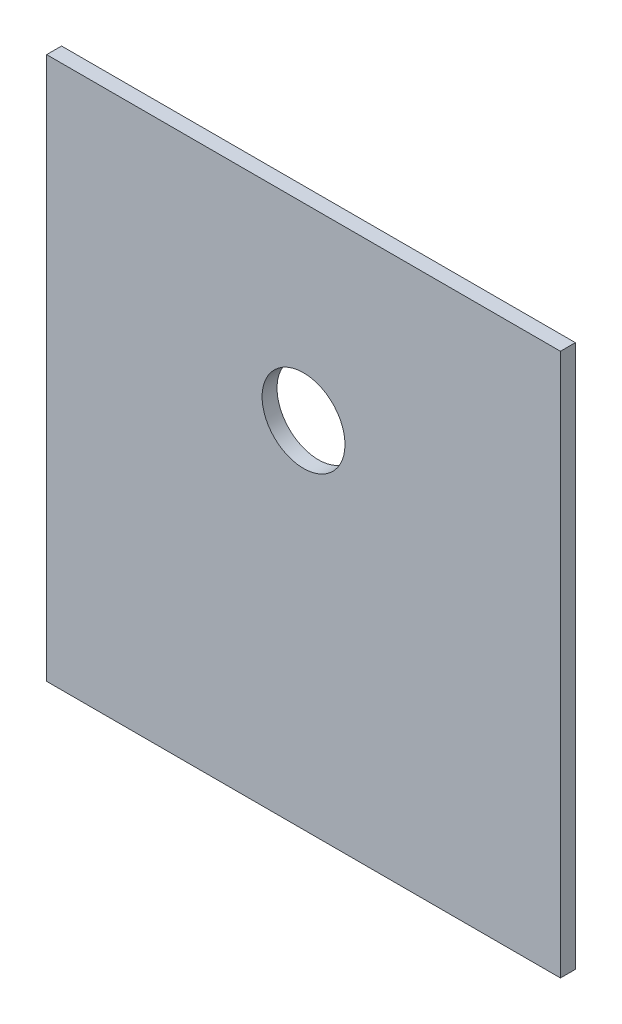
ISO-10303-21;
HEADER;
FILE_DESCRIPTION(('STEP AP214'),'2;1');
FILE_NAME('part.step','',(''),(''),'','','');
FILE_SCHEMA(('AUTOMOTIVE_DESIGN { 1 0 10303 214 1 1 1 1 }'));
ENDSEC;
DATA;
#1=APPLICATION_CONTEXT('core data for automotive mechanical design processes');
#2=APPLICATION_PROTOCOL_DEFINITION('international standard','automotive_design',2000,#1);
#3=PRODUCT_CONTEXT('',#1,'mechanical');
#4=PRODUCT('Part','Part','',(#3));
#5=PRODUCT_RELATED_PRODUCT_CATEGORY('part','',(#4));
#6=PRODUCT_DEFINITION_FORMATION('','',#4);
#7=PRODUCT_DEFINITION_CONTEXT('part definition',#1,'design');
#8=PRODUCT_DEFINITION('design','',#6,#7);
#9=PRODUCT_DEFINITION_SHAPE('','',#8);
#10=(LENGTH_UNIT() NAMED_UNIT(*) SI_UNIT(.MILLI.,.METRE.));
#11=(NAMED_UNIT(*) PLANE_ANGLE_UNIT() SI_UNIT($,.RADIAN.));
#12=(NAMED_UNIT(*) SI_UNIT($,.STERADIAN.) SOLID_ANGLE_UNIT());
#13=UNCERTAINTY_MEASURE_WITH_UNIT(LENGTH_MEASURE(1.E-05),#10,'distance_accuracy_value','');
#14=(GEOMETRIC_REPRESENTATION_CONTEXT(3) GLOBAL_UNCERTAINTY_ASSIGNED_CONTEXT((#13)) GLOBAL_UNIT_ASSIGNED_CONTEXT((#10,
#11,#12)) REPRESENTATION_CONTEXT('',''));
#15=CARTESIAN_POINT('',(0.,0.,0.));
#16=DIRECTION('',(0.,0.,1.));
#17=DIRECTION('',(1.,0.,0.));
#18=AXIS2_PLACEMENT_3D('',#15,#16,#17);
#19=CARTESIAN_POINT('',(31.,-32.75,0.9));
#20=DIRECTION('',(-1.,0.,0.));
#21=DIRECTION('',(0.,0.,1.));
#22=AXIS2_PLACEMENT_3D('',#19,#20,#21);
#23=PLANE('',#22);
#24=DIRECTION('',(0.,1.,0.));
#25=VECTOR('',#24,1.);
#26=CARTESIAN_POINT('',(31.,-32.75,-0.9));
#27=LINE('',#26,#25);
#28=CARTESIAN_POINT('',(31.,-32.75,-0.9));
#29=VERTEX_POINT('',#28);
#30=CARTESIAN_POINT('',(31.,32.75,-0.9));
#31=VERTEX_POINT('',#30);
#32=EDGE_CURVE('E98',#29,#31,#27,.T.);
#33=ORIENTED_EDGE('',*,*,#32,.T.);
#34=DIRECTION('',(0.,0.,-1.));
#35=VECTOR('',#34,1.);
#36=CARTESIAN_POINT('',(31.,32.75,0.9));
#37=LINE('',#36,#35);
#38=CARTESIAN_POINT('',(31.,32.75,0.9));
#39=VERTEX_POINT('',#38);
#40=EDGE_CURVE('E11',#39,#31,#37,.T.);
#41=ORIENTED_EDGE('',*,*,#40,.F.);
#42=DIRECTION('',(0.,1.,0.));
#43=VECTOR('',#42,1.);
#44=CARTESIAN_POINT('',(31.,-32.75,0.9));
#45=LINE('',#44,#43);
#46=CARTESIAN_POINT('',(31.,-32.75,0.9));
#47=VERTEX_POINT('',#46);
#48=EDGE_CURVE('E86',#47,#39,#45,.T.);
#49=ORIENTED_EDGE('',*,*,#48,.F.);
#50=DIRECTION('',(0.,0.,-1.));
#51=VECTOR('',#50,1.);
#52=CARTESIAN_POINT('',(31.,-32.75,0.9));
#53=LINE('',#52,#51);
#54=EDGE_CURVE('E94',#47,#29,#53,.T.);
#55=ORIENTED_EDGE('',*,*,#54,.T.);
#56=EDGE_LOOP('',(#33,#41,#49,#55));
#57=FACE_BOUND('',#56,.T.);
#58=ADVANCED_FACE('F35',(#57),#23,.F.);
#59=CARTESIAN_POINT('',(-31.,32.75,0.9));
#60=DIRECTION('',(0.,-1.,0.));
#61=DIRECTION('',(1.,0.,0.));
#62=AXIS2_PLACEMENT_3D('',#59,#60,#61);
#63=PLANE('',#62);
#64=DIRECTION('',(-1.,0.,0.));
#65=VECTOR('',#64,1.);
#66=CARTESIAN_POINT('',(-31.,32.75,-0.9));
#67=LINE('',#66,#65);
#68=CARTESIAN_POINT('',(-31.,32.75,-0.9));
#69=VERTEX_POINT('',#68);
#70=EDGE_CURVE('E90',#31,#69,#67,.T.);
#71=ORIENTED_EDGE('',*,*,#70,.T.);
#72=DIRECTION('',(0.,0.,-1.));
#73=VECTOR('',#72,1.);
#74=CARTESIAN_POINT('',(-31.,32.75,0.9));
#75=LINE('',#74,#73);
#76=CARTESIAN_POINT('',(-31.,32.75,0.9));
#77=VERTEX_POINT('',#76);
#78=EDGE_CURVE('E43',#77,#69,#75,.T.);
#79=ORIENTED_EDGE('',*,*,#78,.F.);
#80=DIRECTION('',(-1.,0.,0.));
#81=VECTOR('',#80,1.);
#82=CARTESIAN_POINT('',(-31.,32.75,0.9));
#83=LINE('',#82,#81);
#84=EDGE_CURVE('E81',#39,#77,#83,.T.);
#85=ORIENTED_EDGE('',*,*,#84,.F.);
#86=ORIENTED_EDGE('',*,*,#40,.T.);
#87=EDGE_LOOP('',(#71,#79,#85,#86));
#88=FACE_BOUND('',#87,.T.);
#89=ADVANCED_FACE('F89',(#88),#63,.F.);
#90=CARTESIAN_POINT('',(-31.,-32.75,0.9));
#91=DIRECTION('',(1.,0.,0.));
#92=DIRECTION('',(0.,0.,-1.));
#93=AXIS2_PLACEMENT_3D('',#90,#91,#92);
#94=PLANE('',#93);
#95=DIRECTION('',(0.,-1.,0.));
#96=VECTOR('',#95,1.);
#97=CARTESIAN_POINT('',(-31.,-32.75,-0.9));
#98=LINE('',#97,#96);
#99=CARTESIAN_POINT('',(-31.,-32.75,-0.9));
#100=VERTEX_POINT('',#99);
#101=EDGE_CURVE('E68',#69,#100,#98,.T.);
#102=ORIENTED_EDGE('',*,*,#101,.T.);
#103=DIRECTION('',(0.,0.,-1.));
#104=VECTOR('',#103,1.);
#105=CARTESIAN_POINT('',(-31.,-32.75,0.9));
#106=LINE('',#105,#104);
#107=CARTESIAN_POINT('',(-31.,-32.75,0.9));
#108=VERTEX_POINT('',#107);
#109=EDGE_CURVE('E91',#108,#100,#106,.T.);
#110=ORIENTED_EDGE('',*,*,#109,.F.);
#111=DIRECTION('',(0.,-1.,0.));
#112=VECTOR('',#111,1.);
#113=CARTESIAN_POINT('',(-31.,-32.75,0.9));
#114=LINE('',#113,#112);
#115=EDGE_CURVE('E84',#77,#108,#114,.T.);
#116=ORIENTED_EDGE('',*,*,#115,.F.);
#117=ORIENTED_EDGE('',*,*,#78,.T.);
#118=EDGE_LOOP('',(#102,#110,#116,#117));
#119=FACE_BOUND('',#118,.T.);
#120=ADVANCED_FACE('F92',(#119),#94,.F.);
#121=CARTESIAN_POINT('',(-31.,-32.75,0.9));
#122=DIRECTION('',(0.,1.,0.));
#123=DIRECTION('',(0.,0.,1.));
#124=AXIS2_PLACEMENT_3D('',#121,#122,#123);
#125=PLANE('',#124);
#126=DIRECTION('',(1.,0.,0.));
#127=VECTOR('',#126,1.);
#128=CARTESIAN_POINT('',(-31.,-32.75,-0.9));
#129=LINE('',#128,#127);
#130=EDGE_CURVE('E74',#100,#29,#129,.T.);
#131=ORIENTED_EDGE('',*,*,#130,.T.);
#132=ORIENTED_EDGE('',*,*,#54,.F.);
#133=DIRECTION('',(1.,0.,0.));
#134=VECTOR('',#133,1.);
#135=CARTESIAN_POINT('',(-31.,-32.75,0.9));
#136=LINE('',#135,#134);
#137=EDGE_CURVE('E51',#108,#47,#136,.T.);
#138=ORIENTED_EDGE('',*,*,#137,.F.);
#139=ORIENTED_EDGE('',*,*,#109,.T.);
#140=EDGE_LOOP('',(#131,#132,#138,#139));
#141=FACE_BOUND('',#140,.T.);
#142=ADVANCED_FACE('F106',(#141),#125,.F.);
#143=CARTESIAN_POINT('',(0.,0.,0.9));
#144=DIRECTION('',(0.,0.,-1.));
#145=DIRECTION('',(-1.,0.,0.));
#146=AXIS2_PLACEMENT_3D('',#143,#144,#145);
#147=PLANE('',#146);
#148=CARTESIAN_POINT('',(0.,10.,0.9));
#149=DIRECTION('',(0.,0.,1.));
#150=DIRECTION('',(1.,0.,0.));
#151=AXIS2_PLACEMENT_3D('',#148,#149,#150);
#152=CIRCLE('',#151,5.);
#153=CARTESIAN_POINT('',(5.,10.,0.9));
#154=VERTEX_POINT('',#153);
#155=EDGE_CURVE('E112',#154,#154,#152,.T.);
#156=ORIENTED_EDGE('',*,*,#155,.F.);
#157=EDGE_LOOP('',(#156));
#158=FACE_BOUND('',#157,.T.);
#159=ORIENTED_EDGE('',*,*,#48,.T.);
#160=ORIENTED_EDGE('',*,*,#84,.T.);
#161=ORIENTED_EDGE('',*,*,#115,.T.);
#162=ORIENTED_EDGE('',*,*,#137,.T.);
#163=EDGE_LOOP('',(#159,#160,#161,#162));
#164=FACE_BOUND('',#163,.T.);
#165=ADVANCED_FACE('F82',(#158,#164),#147,.F.);
#166=CARTESIAN_POINT('',(0.,0.,-0.9));
#167=DIRECTION('',(0.,0.,-1.));
#168=DIRECTION('',(-1.,0.,0.));
#169=AXIS2_PLACEMENT_3D('',#166,#167,#168);
#170=PLANE('',#169);
#171=CARTESIAN_POINT('',(0.,10.,-0.9));
#172=DIRECTION('',(0.,0.,1.));
#173=DIRECTION('',(1.,0.,0.));
#174=AXIS2_PLACEMENT_3D('',#171,#172,#173);
#175=CIRCLE('',#174,5.);
#176=CARTESIAN_POINT('',(5.,10.,-0.9));
#177=VERTEX_POINT('',#176);
#178=EDGE_CURVE('E101',#177,#177,#175,.T.);
#179=ORIENTED_EDGE('',*,*,#178,.T.);
#180=EDGE_LOOP('',(#179));
#181=FACE_BOUND('',#180,.T.);
#182=ORIENTED_EDGE('',*,*,#32,.F.);
#183=ORIENTED_EDGE('',*,*,#130,.F.);
#184=ORIENTED_EDGE('',*,*,#101,.F.);
#185=ORIENTED_EDGE('',*,*,#70,.F.);
#186=EDGE_LOOP('',(#182,#183,#184,#185));
#187=FACE_BOUND('',#186,.T.);
#188=ADVANCED_FACE('F109',(#181,#187),#170,.T.);
#189=CARTESIAN_POINT('',(0.,10.,-0.9));
#190=DIRECTION('',(0.,0.,1.));
#191=DIRECTION('',(1.,0.,0.));
#192=AXIS2_PLACEMENT_3D('',#189,#190,#191);
#193=CYLINDRICAL_SURFACE('',#192,5.);
#194=ORIENTED_EDGE('',*,*,#178,.F.);
#195=EDGE_LOOP('',(#194));
#196=FACE_BOUND('',#195,.T.);
#197=ORIENTED_EDGE('',*,*,#155,.T.);
#198=EDGE_LOOP('',(#197));
#199=FACE_BOUND('',#198,.T.);
#200=ADVANCED_FACE('F119',(#196,#199),#193,.F.);
#201=CLOSED_SHELL('',(#58,#89,#120,#142,#165,#188,#200));
#202=MANIFOLD_SOLID_BREP('B2',#201);
#203=ADVANCED_BREP_SHAPE_REPRESENTATION('',(#18,#202),#14);
#204=SHAPE_DEFINITION_REPRESENTATION(#9,#203);
ENDSEC;
END-ISO-10303-21;
